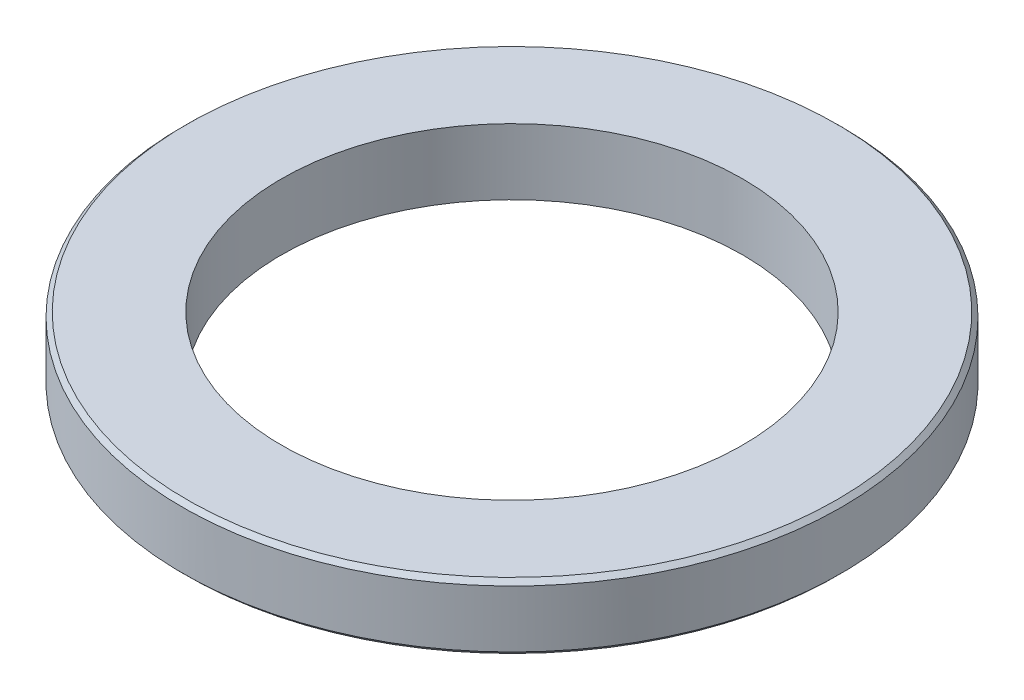
ISO-10303-21;
HEADER;
FILE_DESCRIPTION(('STEP AP214'),'2;1');
FILE_NAME('part.step','',(''),(''),'','','');
FILE_SCHEMA(('AUTOMOTIVE_DESIGN { 1 0 10303 214 1 1 1 1 }'));
ENDSEC;
DATA;
#1=APPLICATION_CONTEXT('core data for automotive mechanical design processes');
#2=APPLICATION_PROTOCOL_DEFINITION('international standard','automotive_design',2000,#1);
#3=PRODUCT_CONTEXT('',#1,'mechanical');
#4=PRODUCT('Part','Part','',(#3));
#5=PRODUCT_RELATED_PRODUCT_CATEGORY('part','',(#4));
#6=PRODUCT_DEFINITION_FORMATION('','',#4);
#7=PRODUCT_DEFINITION_CONTEXT('part definition',#1,'design');
#8=PRODUCT_DEFINITION('design','',#6,#7);
#9=PRODUCT_DEFINITION_SHAPE('','',#8);
#10=(LENGTH_UNIT() NAMED_UNIT(*) SI_UNIT(.MILLI.,.METRE.));
#11=(NAMED_UNIT(*) PLANE_ANGLE_UNIT() SI_UNIT($,.RADIAN.));
#12=(NAMED_UNIT(*) SI_UNIT($,.STERADIAN.) SOLID_ANGLE_UNIT());
#13=UNCERTAINTY_MEASURE_WITH_UNIT(LENGTH_MEASURE(1.E-05),#10,'distance_accuracy_value','');
#14=(GEOMETRIC_REPRESENTATION_CONTEXT(3) GLOBAL_UNCERTAINTY_ASSIGNED_CONTEXT((#13)) GLOBAL_UNIT_ASSIGNED_CONTEXT((#10,
#11,#12)) REPRESENTATION_CONTEXT('',''));
#15=CARTESIAN_POINT('',(0.,0.,0.));
#16=DIRECTION('',(0.,0.,1.));
#17=DIRECTION('',(1.,0.,0.));
#18=AXIS2_PLACEMENT_3D('',#15,#16,#17);
#19=CARTESIAN_POINT('',(0.,-3.4,0.));
#20=DIRECTION('',(0.,1.,0.));
#21=DIRECTION('',(-1.,0.,0.));
#22=AXIS2_PLACEMENT_3D('',#19,#20,#21);
#23=CONICAL_SURFACE('',#22,7.5,0.785398163397459);
#24=CARTESIAN_POINT('',(0.,-3.5,0.));
#25=DIRECTION('',(0.,1.,0.));
#26=DIRECTION('',(-1.,0.,0.));
#27=AXIS2_PLACEMENT_3D('',#24,#25,#26);
#28=CIRCLE('',#27,7.4);
#29=CARTESIAN_POINT('',(-7.4,-3.5,0.));
#30=VERTEX_POINT('',#29);
#31=EDGE_CURVE('E18',#30,#30,#28,.F.);
#32=ORIENTED_EDGE('',*,*,#31,.F.);
#33=EDGE_LOOP('',(#32));
#34=FACE_BOUND('',#33,.T.);
#35=CARTESIAN_POINT('',(0.,-3.4,0.));
#36=DIRECTION('',(0.,-1.,0.));
#37=DIRECTION('',(0.,0.,-1.));
#38=AXIS2_PLACEMENT_3D('',#35,#36,#37);
#39=CIRCLE('',#38,7.5);
#40=CARTESIAN_POINT('',(0.,-3.4,-7.5));
#41=VERTEX_POINT('',#40);
#42=EDGE_CURVE('E39',#41,#41,#39,.F.);
#43=ORIENTED_EDGE('',*,*,#42,.F.);
#44=EDGE_LOOP('',(#43));
#45=FACE_BOUND('',#44,.T.);
#46=ADVANCED_FACE('F15',(#34,#45),#23,.T.);
#47=CARTESIAN_POINT('',(0.,19.2132034355964,0.));
#48=DIRECTION('',(0.,-1.,0.));
#49=DIRECTION('',(0.,0.,-1.));
#50=AXIS2_PLACEMENT_3D('',#47,#48,#49);
#51=CYLINDRICAL_SURFACE('',#50,7.5);
#52=CARTESIAN_POINT('',(0.,-2.1,0.));
#53=DIRECTION('',(0.,-1.,0.));
#54=DIRECTION('',(0.,0.,-1.));
#55=AXIS2_PLACEMENT_3D('',#52,#53,#54);
#56=CIRCLE('',#55,7.5);
#57=CARTESIAN_POINT('',(0.,-2.1,-7.5));
#58=VERTEX_POINT('',#57);
#59=EDGE_CURVE('E30',#58,#58,#56,.F.);
#60=ORIENTED_EDGE('',*,*,#59,.F.);
#61=EDGE_LOOP('',(#60));
#62=FACE_BOUND('',#61,.T.);
#63=ORIENTED_EDGE('',*,*,#42,.T.);
#64=EDGE_LOOP('',(#63));
#65=FACE_BOUND('',#64,.T.);
#66=ADVANCED_FACE('F47',(#62,#65),#51,.T.);
#67=CARTESIAN_POINT('',(0.,-3.5,0.));
#68=DIRECTION('',(0.,-1.,0.));
#69=DIRECTION('',(0.,0.,-1.));
#70=AXIS2_PLACEMENT_3D('',#67,#68,#69);
#71=PLANE('',#70);
#72=CARTESIAN_POINT('',(0.,-3.5,0.));
#73=DIRECTION('',(0.,-1.,0.));
#74=DIRECTION('',(0.,0.,-1.));
#75=AXIS2_PLACEMENT_3D('',#72,#73,#74);
#76=CIRCLE('',#75,5.25);
#77=CARTESIAN_POINT('',(0.,-3.5,-5.25));
#78=VERTEX_POINT('',#77);
#79=EDGE_CURVE('E27',#78,#78,#76,.F.);
#80=ORIENTED_EDGE('',*,*,#79,.T.);
#81=EDGE_LOOP('',(#80));
#82=FACE_BOUND('',#81,.T.);
#83=ORIENTED_EDGE('',*,*,#31,.T.);
#84=EDGE_LOOP('',(#83));
#85=FACE_BOUND('',#84,.T.);
#86=ADVANCED_FACE('F56',(#82,#85),#71,.T.);
#87=CARTESIAN_POINT('',(0.,-2.1,0.));
#88=DIRECTION('',(0.,-1.,0.));
#89=DIRECTION('',(1.,0.,0.));
#90=AXIS2_PLACEMENT_3D('',#87,#88,#89);
#91=CONICAL_SURFACE('',#90,7.5,0.785398163397455);
#92=CARTESIAN_POINT('',(0.,-2.,0.));
#93=DIRECTION('',(0.,-1.,0.));
#94=DIRECTION('',(1.,0.,0.));
#95=AXIS2_PLACEMENT_3D('',#92,#93,#94);
#96=CIRCLE('',#95,7.4);
#97=CARTESIAN_POINT('',(7.4,-2.,0.));
#98=VERTEX_POINT('',#97);
#99=EDGE_CURVE('E22',#98,#98,#96,.F.);
#100=ORIENTED_EDGE('',*,*,#99,.F.);
#101=EDGE_LOOP('',(#100));
#102=FACE_BOUND('',#101,.T.);
#103=ORIENTED_EDGE('',*,*,#59,.T.);
#104=EDGE_LOOP('',(#103));
#105=FACE_BOUND('',#104,.T.);
#106=ADVANCED_FACE('F66',(#102,#105),#91,.T.);
#107=CARTESIAN_POINT('',(0.,19.2132034355964,0.));
#108=DIRECTION('',(0.,-1.,0.));
#109=DIRECTION('',(0.,0.,-1.));
#110=AXIS2_PLACEMENT_3D('',#107,#108,#109);
#111=CYLINDRICAL_SURFACE('',#110,5.25);
#112=ORIENTED_EDGE('',*,*,#79,.F.);
#113=EDGE_LOOP('',(#112));
#114=FACE_BOUND('',#113,.T.);
#115=CARTESIAN_POINT('',(0.,-2.,0.));
#116=DIRECTION('',(0.,-1.,0.));
#117=DIRECTION('',(0.,0.,-1.));
#118=AXIS2_PLACEMENT_3D('',#115,#116,#117);
#119=CIRCLE('',#118,5.25);
#120=CARTESIAN_POINT('',(0.,-2.,-5.25));
#121=VERTEX_POINT('',#120);
#122=EDGE_CURVE('E10',#121,#121,#119,.T.);
#123=ORIENTED_EDGE('',*,*,#122,.F.);
#124=EDGE_LOOP('',(#123));
#125=FACE_BOUND('',#124,.T.);
#126=ADVANCED_FACE('F60',(#114,#125),#111,.F.);
#127=CARTESIAN_POINT('',(6.11,-2.,0.));
#128=DIRECTION('',(0.,1.,0.));
#129=DIRECTION('',(0.,0.,1.));
#130=AXIS2_PLACEMENT_3D('',#127,#128,#129);
#131=PLANE('',#130);
#132=ORIENTED_EDGE('',*,*,#122,.T.);
#133=EDGE_LOOP('',(#132));
#134=FACE_BOUND('',#133,.T.);
#135=ORIENTED_EDGE('',*,*,#99,.T.);
#136=EDGE_LOOP('',(#135));
#137=FACE_BOUND('',#136,.T.);
#138=ADVANCED_FACE('F58',(#134,#137),#131,.T.);
#139=CLOSED_SHELL('',(#46,#66,#86,#106,#126,#138));
#140=MANIFOLD_SOLID_BREP('B1',#139);
#141=ADVANCED_BREP_SHAPE_REPRESENTATION('',(#18,#140),#14);
#142=SHAPE_DEFINITION_REPRESENTATION(#9,#141);
ENDSEC;
END-ISO-10303-21;
